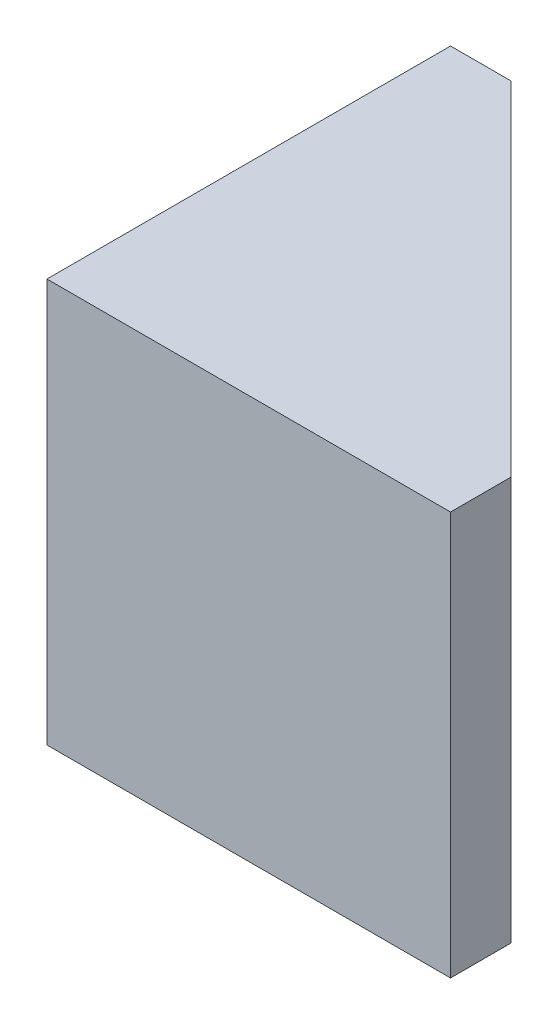
ISO-10303-21;
HEADER;
FILE_DESCRIPTION(('STEP AP214'),'2;1');
FILE_NAME('part.step','',(''),(''),'','','');
FILE_SCHEMA(('AUTOMOTIVE_DESIGN { 1 0 10303 214 1 1 1 1 }'));
ENDSEC;
DATA;
#1=APPLICATION_CONTEXT('core data for automotive mechanical design processes');
#2=APPLICATION_PROTOCOL_DEFINITION('international standard','automotive_design',2000,#1);
#3=PRODUCT_CONTEXT('',#1,'mechanical');
#4=PRODUCT('Part','Part','',(#3));
#5=PRODUCT_RELATED_PRODUCT_CATEGORY('part','',(#4));
#6=PRODUCT_DEFINITION_FORMATION('','',#4);
#7=PRODUCT_DEFINITION_CONTEXT('part definition',#1,'design');
#8=PRODUCT_DEFINITION('design','',#6,#7);
#9=PRODUCT_DEFINITION_SHAPE('','',#8);
#10=(LENGTH_UNIT() NAMED_UNIT(*) SI_UNIT(.MILLI.,.METRE.));
#11=(NAMED_UNIT(*) PLANE_ANGLE_UNIT() SI_UNIT($,.RADIAN.));
#12=(NAMED_UNIT(*) SI_UNIT($,.STERADIAN.) SOLID_ANGLE_UNIT());
#13=UNCERTAINTY_MEASURE_WITH_UNIT(LENGTH_MEASURE(1.E-05),#10,'distance_accuracy_value','');
#14=(GEOMETRIC_REPRESENTATION_CONTEXT(3) GLOBAL_UNCERTAINTY_ASSIGNED_CONTEXT((#13)) GLOBAL_UNIT_ASSIGNED_CONTEXT((#10,
#11,#12)) REPRESENTATION_CONTEXT('',''));
#15=CARTESIAN_POINT('',(0.,0.,0.));
#16=DIRECTION('',(0.,0.,1.));
#17=DIRECTION('',(1.,0.,0.));
#18=AXIS2_PLACEMENT_3D('',#15,#16,#17);
#19=CARTESIAN_POINT('',(0.,10.,0.));
#20=DIRECTION('',(0.,0.,1.));
#21=DIRECTION('',(1.,0.,0.));
#22=AXIS2_PLACEMENT_3D('',#19,#20,#21);
#23=PLANE('',#22);
#24=DIRECTION('',(-1.,0.,0.));
#25=VECTOR('',#24,1.);
#26=CARTESIAN_POINT('',(0.,-10.,0.));
#27=LINE('',#26,#25);
#28=CARTESIAN_POINT('',(20.,-10.,0.));
#29=VERTEX_POINT('',#28);
#30=CARTESIAN_POINT('',(0.,-10.,0.));
#31=VERTEX_POINT('',#30);
#32=EDGE_CURVE('E120',#29,#31,#27,.T.);
#33=ORIENTED_EDGE('',*,*,#32,.F.);
#34=DIRECTION('',(0.,-1.,0.));
#35=VECTOR('',#34,1.);
#36=CARTESIAN_POINT('',(20.,10.,0.));
#37=LINE('',#36,#35);
#38=CARTESIAN_POINT('',(20.,10.,0.));
#39=VERTEX_POINT('',#38);
#40=EDGE_CURVE('E11',#39,#29,#37,.T.);
#41=ORIENTED_EDGE('',*,*,#40,.F.);
#42=DIRECTION('',(-1.,0.,0.));
#43=VECTOR('',#42,1.);
#44=CARTESIAN_POINT('',(0.,10.,0.));
#45=LINE('',#44,#43);
#46=CARTESIAN_POINT('',(0.,10.,0.));
#47=VERTEX_POINT('',#46);
#48=EDGE_CURVE('E139',#39,#47,#45,.T.);
#49=ORIENTED_EDGE('',*,*,#48,.T.);
#50=DIRECTION('',(0.,-1.,0.));
#51=VECTOR('',#50,1.);
#52=CARTESIAN_POINT('',(0.,10.,0.));
#53=LINE('',#52,#51);
#54=EDGE_CURVE('E151',#47,#31,#53,.T.);
#55=ORIENTED_EDGE('',*,*,#54,.T.);
#56=EDGE_LOOP('',(#33,#41,#49,#55));
#57=FACE_BOUND('',#56,.T.);
#58=ADVANCED_FACE('F37',(#57),#23,.T.);
#59=CARTESIAN_POINT('',(20.,10.,0.));
#60=DIRECTION('',(1.,0.,0.));
#61=DIRECTION('',(0.,0.,-1.));
#62=AXIS2_PLACEMENT_3D('',#59,#60,#61);
#63=PLANE('',#62);
#64=DIRECTION('',(0.,0.,1.));
#65=VECTOR('',#64,1.);
#66=CARTESIAN_POINT('',(20.,-10.,0.));
#67=LINE('',#66,#65);
#68=CARTESIAN_POINT('',(20.,-10.,-3.));
#69=VERTEX_POINT('',#68);
#70=EDGE_CURVE('E154',#69,#29,#67,.T.);
#71=ORIENTED_EDGE('',*,*,#70,.F.);
#72=DIRECTION('',(0.,-1.,0.));
#73=VECTOR('',#72,1.);
#74=CARTESIAN_POINT('',(20.,-7.,-3.));
#75=LINE('',#74,#73);
#76=CARTESIAN_POINT('',(20.,-7.,-3.));
#77=VERTEX_POINT('',#76);
#78=EDGE_CURVE('E121',#77,#69,#75,.T.);
#79=ORIENTED_EDGE('',*,*,#78,.F.);
#80=DIRECTION('',(0.,-1.,0.));
#81=VECTOR('',#80,1.);
#82=CARTESIAN_POINT('',(20.,10.,-3.));
#83=LINE('',#82,#81);
#84=CARTESIAN_POINT('',(20.,7.,-3.));
#85=VERTEX_POINT('',#84);
#86=EDGE_CURVE('E163',#85,#77,#83,.T.);
#87=ORIENTED_EDGE('',*,*,#86,.F.);
#88=CARTESIAN_POINT('',(20.,10.,-3.));
#89=VERTEX_POINT('',#88);
#90=EDGE_CURVE('E44',#89,#85,#83,.T.);
#91=ORIENTED_EDGE('',*,*,#90,.F.);
#92=DIRECTION('',(0.,0.,1.));
#93=VECTOR('',#92,1.);
#94=CARTESIAN_POINT('',(20.,10.,0.));
#95=LINE('',#94,#93);
#96=EDGE_CURVE('E142',#89,#39,#95,.T.);
#97=ORIENTED_EDGE('',*,*,#96,.T.);
#98=ORIENTED_EDGE('',*,*,#40,.T.);
#99=EDGE_LOOP('',(#71,#79,#87,#91,#97,#98));
#100=FACE_BOUND('',#99,.T.);
#101=ADVANCED_FACE('F171',(#100),#63,.T.);
#102=CARTESIAN_POINT('',(0.,10.,-3.));
#103=DIRECTION('',(0.,0.,-1.));
#104=DIRECTION('',(-1.,0.,0.));
#105=AXIS2_PLACEMENT_3D('',#102,#103,#104);
#106=PLANE('',#105);
#107=DIRECTION('',(1.,0.,0.));
#108=VECTOR('',#107,1.);
#109=CARTESIAN_POINT('',(0.,7.,-3.));
#110=LINE('',#109,#108);
#111=CARTESIAN_POINT('',(2.99999999999999,7.,-3.));
#112=VERTEX_POINT('',#111);
#113=EDGE_CURVE('E51',#112,#85,#110,.T.);
#114=ORIENTED_EDGE('',*,*,#113,.T.);
#115=ORIENTED_EDGE('',*,*,#86,.T.);
#116=DIRECTION('',(1.,0.,0.));
#117=VECTOR('',#116,1.);
#118=CARTESIAN_POINT('',(0.,-7.,-3.));
#119=LINE('',#118,#117);
#120=CARTESIAN_POINT('',(2.99999999999999,-7.,-3.));
#121=VERTEX_POINT('',#120);
#122=EDGE_CURVE('E129',#121,#77,#119,.T.);
#123=ORIENTED_EDGE('',*,*,#122,.F.);
#124=DIRECTION('',(0.,-1.,0.));
#125=VECTOR('',#124,1.);
#126=CARTESIAN_POINT('',(2.99999999999999,10.,-3.));
#127=LINE('',#126,#125);
#128=EDGE_CURVE('E132',#112,#121,#127,.T.);
#129=ORIENTED_EDGE('',*,*,#128,.F.);
#130=EDGE_LOOP('',(#114,#115,#123,#129));
#131=FACE_BOUND('',#130,.T.);
#132=ADVANCED_FACE('F167',(#131),#106,.T.);
#133=CARTESIAN_POINT('',(2.99999999999999,10.,0.));
#134=DIRECTION('',(1.,0.,0.));
#135=DIRECTION('',(0.,0.,-1.));
#136=AXIS2_PLACEMENT_3D('',#133,#134,#135);
#137=PLANE('',#136);
#138=DIRECTION('',(0.,0.,1.));
#139=VECTOR('',#138,1.);
#140=CARTESIAN_POINT('',(2.99999999999999,7.,0.));
#141=LINE('',#140,#139);
#142=CARTESIAN_POINT('',(2.99999999999999,7.,-20.));
#143=VERTEX_POINT('',#142);
#144=EDGE_CURVE('E59',#143,#112,#141,.T.);
#145=ORIENTED_EDGE('',*,*,#144,.T.);
#146=ORIENTED_EDGE('',*,*,#128,.T.);
#147=DIRECTION('',(0.,0.,1.));
#148=VECTOR('',#147,1.);
#149=CARTESIAN_POINT('',(2.99999999999999,-7.,0.));
#150=LINE('',#149,#148);
#151=CARTESIAN_POINT('',(2.99999999999999,-7.,-20.));
#152=VERTEX_POINT('',#151);
#153=EDGE_CURVE('E127',#152,#121,#150,.T.);
#154=ORIENTED_EDGE('',*,*,#153,.F.);
#155=DIRECTION('',(0.,-1.,0.));
#156=VECTOR('',#155,1.);
#157=CARTESIAN_POINT('',(2.99999999999999,10.,-20.));
#158=LINE('',#157,#156);
#159=EDGE_CURVE('E100',#143,#152,#158,.T.);
#160=ORIENTED_EDGE('',*,*,#159,.F.);
#161=EDGE_LOOP('',(#145,#146,#154,#160));
#162=FACE_BOUND('',#161,.T.);
#163=ADVANCED_FACE('F131',(#162),#137,.T.);
#164=CARTESIAN_POINT('',(0.,10.,-20.));
#165=DIRECTION('',(0.,0.,-1.));
#166=DIRECTION('',(-1.,0.,0.));
#167=AXIS2_PLACEMENT_3D('',#164,#165,#166);
#168=PLANE('',#167);
#169=DIRECTION('',(1.,0.,0.));
#170=VECTOR('',#169,1.);
#171=CARTESIAN_POINT('',(0.,-10.,-20.));
#172=LINE('',#171,#170);
#173=CARTESIAN_POINT('',(0.,-10.,-20.));
#174=VERTEX_POINT('',#173);
#175=CARTESIAN_POINT('',(2.99999999999999,-10.,-20.));
#176=VERTEX_POINT('',#175);
#177=EDGE_CURVE('E157',#174,#176,#172,.T.);
#178=ORIENTED_EDGE('',*,*,#177,.F.);
#179=DIRECTION('',(0.,-1.,0.));
#180=VECTOR('',#179,1.);
#181=CARTESIAN_POINT('',(0.,10.,-20.));
#182=LINE('',#181,#180);
#183=CARTESIAN_POINT('',(0.,10.,-20.));
#184=VERTEX_POINT('',#183);
#185=EDGE_CURVE('E110',#184,#174,#182,.T.);
#186=ORIENTED_EDGE('',*,*,#185,.F.);
#187=DIRECTION('',(1.,0.,0.));
#188=VECTOR('',#187,1.);
#189=CARTESIAN_POINT('',(0.,10.,-20.));
#190=LINE('',#189,#188);
#191=CARTESIAN_POINT('',(2.99999999999999,10.,-20.));
#192=VERTEX_POINT('',#191);
#193=EDGE_CURVE('E146',#184,#192,#190,.T.);
#194=ORIENTED_EDGE('',*,*,#193,.T.);
#195=EDGE_CURVE('E107',#192,#143,#158,.T.);
#196=ORIENTED_EDGE('',*,*,#195,.T.);
#197=ORIENTED_EDGE('',*,*,#159,.T.);
#198=DIRECTION('',(0.,-1.,0.));
#199=VECTOR('',#198,1.);
#200=CARTESIAN_POINT('',(2.99999999999999,-7.,-20.));
#201=LINE('',#200,#199);
#202=EDGE_CURVE('E104',#152,#176,#201,.T.);
#203=ORIENTED_EDGE('',*,*,#202,.T.);
#204=EDGE_LOOP('',(#178,#186,#194,#196,#197,#203));
#205=FACE_BOUND('',#204,.T.);
#206=ADVANCED_FACE('F103',(#205),#168,.T.);
#207=CARTESIAN_POINT('',(0.,10.,0.));
#208=DIRECTION('',(-1.,0.,0.));
#209=DIRECTION('',(0.,0.,1.));
#210=AXIS2_PLACEMENT_3D('',#207,#208,#209);
#211=PLANE('',#210);
#212=DIRECTION('',(0.,0.,-1.));
#213=VECTOR('',#212,1.);
#214=CARTESIAN_POINT('',(0.,-10.,0.));
#215=LINE('',#214,#213);
#216=EDGE_CURVE('E143',#31,#174,#215,.T.);
#217=ORIENTED_EDGE('',*,*,#216,.F.);
#218=ORIENTED_EDGE('',*,*,#54,.F.);
#219=DIRECTION('',(0.,0.,-1.));
#220=VECTOR('',#219,1.);
#221=CARTESIAN_POINT('',(0.,10.,0.));
#222=LINE('',#221,#220);
#223=EDGE_CURVE('E148',#47,#184,#222,.T.);
#224=ORIENTED_EDGE('',*,*,#223,.T.);
#225=ORIENTED_EDGE('',*,*,#185,.T.);
#226=EDGE_LOOP('',(#217,#218,#224,#225));
#227=FACE_BOUND('',#226,.T.);
#228=ADVANCED_FACE('F193',(#227),#211,.T.);
#229=CARTESIAN_POINT('',(0.,10.,0.));
#230=DIRECTION('',(0.,1.,0.));
#231=DIRECTION('',(0.,0.,1.));
#232=AXIS2_PLACEMENT_3D('',#229,#230,#231);
#233=PLANE('',#232);
#234=ORIENTED_EDGE('',*,*,#96,.F.);
#235=DIRECTION('',(0.707106781186548,0.,0.707106781186547));
#236=VECTOR('',#235,1.);
#237=CARTESIAN_POINT('',(11.5,10.,-11.5));
#238=LINE('',#237,#236);
#239=EDGE_CURVE('E176',#192,#89,#238,.T.);
#240=ORIENTED_EDGE('',*,*,#239,.F.);
#241=ORIENTED_EDGE('',*,*,#193,.F.);
#242=ORIENTED_EDGE('',*,*,#223,.F.);
#243=ORIENTED_EDGE('',*,*,#48,.F.);
#244=EDGE_LOOP('',(#234,#240,#241,#242,#243));
#245=FACE_BOUND('',#244,.T.);
#246=ADVANCED_FACE('F184',(#245),#233,.T.);
#247=CARTESIAN_POINT('',(0.,-10.,0.));
#248=DIRECTION('',(0.,1.,0.));
#249=DIRECTION('',(0.,0.,1.));
#250=AXIS2_PLACEMENT_3D('',#247,#248,#249);
#251=PLANE('',#250);
#252=ORIENTED_EDGE('',*,*,#32,.T.);
#253=ORIENTED_EDGE('',*,*,#216,.T.);
#254=ORIENTED_EDGE('',*,*,#177,.T.);
#255=DIRECTION('',(0.707106781186548,0.,0.707106781186547));
#256=VECTOR('',#255,1.);
#257=CARTESIAN_POINT('',(11.5,-10.,-11.5));
#258=LINE('',#257,#256);
#259=EDGE_CURVE('E119',#176,#69,#258,.T.);
#260=ORIENTED_EDGE('',*,*,#259,.T.);
#261=ORIENTED_EDGE('',*,*,#70,.T.);
#262=EDGE_LOOP('',(#252,#253,#254,#260,#261));
#263=FACE_BOUND('',#262,.T.);
#264=ADVANCED_FACE('F191',(#263),#251,.F.);
#265=CARTESIAN_POINT('',(11.5,-7.,-11.5));
#266=DIRECTION('',(0.707106781186547,0.,-0.707106781186548));
#267=DIRECTION('',(-0.707106781186548,0.,-0.707106781186547));
#268=AXIS2_PLACEMENT_3D('',#265,#266,#267);
#269=PLANE('',#268);
#270=ORIENTED_EDGE('',*,*,#259,.F.);
#271=ORIENTED_EDGE('',*,*,#202,.F.);
#272=DIRECTION('',(0.707106781186548,0.,0.707106781186547));
#273=VECTOR('',#272,1.);
#274=CARTESIAN_POINT('',(11.5,-7.,-11.5));
#275=LINE('',#274,#273);
#276=EDGE_CURVE('E117',#152,#77,#275,.T.);
#277=ORIENTED_EDGE('',*,*,#276,.T.);
#278=ORIENTED_EDGE('',*,*,#78,.T.);
#279=EDGE_LOOP('',(#270,#271,#277,#278));
#280=FACE_BOUND('',#279,.T.);
#281=ADVANCED_FACE('F115',(#280),#269,.T.);
#282=CARTESIAN_POINT('',(0.,-7.,0.));
#283=DIRECTION('',(0.,1.,0.));
#284=DIRECTION('',(0.,0.,1.));
#285=AXIS2_PLACEMENT_3D('',#282,#283,#284);
#286=PLANE('',#285);
#287=ORIENTED_EDGE('',*,*,#276,.F.);
#288=ORIENTED_EDGE('',*,*,#153,.T.);
#289=ORIENTED_EDGE('',*,*,#122,.T.);
#290=EDGE_LOOP('',(#287,#288,#289));
#291=FACE_BOUND('',#290,.T.);
#292=ADVANCED_FACE('F126',(#291),#286,.T.);
#293=CARTESIAN_POINT('',(11.5,7.,-11.5));
#294=DIRECTION('',(-0.707106781186547,0.,0.707106781186548));
#295=DIRECTION('',(0.707106781186548,0.,0.707106781186547));
#296=AXIS2_PLACEMENT_3D('',#293,#294,#295);
#297=PLANE('',#296);
#298=ORIENTED_EDGE('',*,*,#239,.T.);
#299=ORIENTED_EDGE('',*,*,#90,.T.);
#300=DIRECTION('',(0.707106781186548,0.,0.707106781186547));
#301=VECTOR('',#300,1.);
#302=CARTESIAN_POINT('',(11.5,7.,-11.5));
#303=LINE('',#302,#301);
#304=EDGE_CURVE('E174',#143,#85,#303,.T.);
#305=ORIENTED_EDGE('',*,*,#304,.F.);
#306=ORIENTED_EDGE('',*,*,#195,.F.);
#307=EDGE_LOOP('',(#298,#299,#305,#306));
#308=FACE_BOUND('',#307,.T.);
#309=ADVANCED_FACE('F181',(#308),#297,.F.);
#310=CARTESIAN_POINT('',(0.,7.,0.));
#311=DIRECTION('',(0.,-1.,0.));
#312=DIRECTION('',(0.,0.,1.));
#313=AXIS2_PLACEMENT_3D('',#310,#311,#312);
#314=PLANE('',#313);
#315=ORIENTED_EDGE('',*,*,#304,.T.);
#316=ORIENTED_EDGE('',*,*,#113,.F.);
#317=ORIENTED_EDGE('',*,*,#144,.F.);
#318=EDGE_LOOP('',(#315,#316,#317));
#319=FACE_BOUND('',#318,.T.);
#320=ADVANCED_FACE('F175',(#319),#314,.T.);
#321=CLOSED_SHELL('',(#58,#101,#132,#163,#206,#228,#246,#264,#281,#292,#309,#320));
#322=MANIFOLD_SOLID_BREP('B2',#321);
#323=ADVANCED_BREP_SHAPE_REPRESENTATION('',(#18,#322),#14);
#324=SHAPE_DEFINITION_REPRESENTATION(#9,#323);
ENDSEC;
END-ISO-10303-21;
